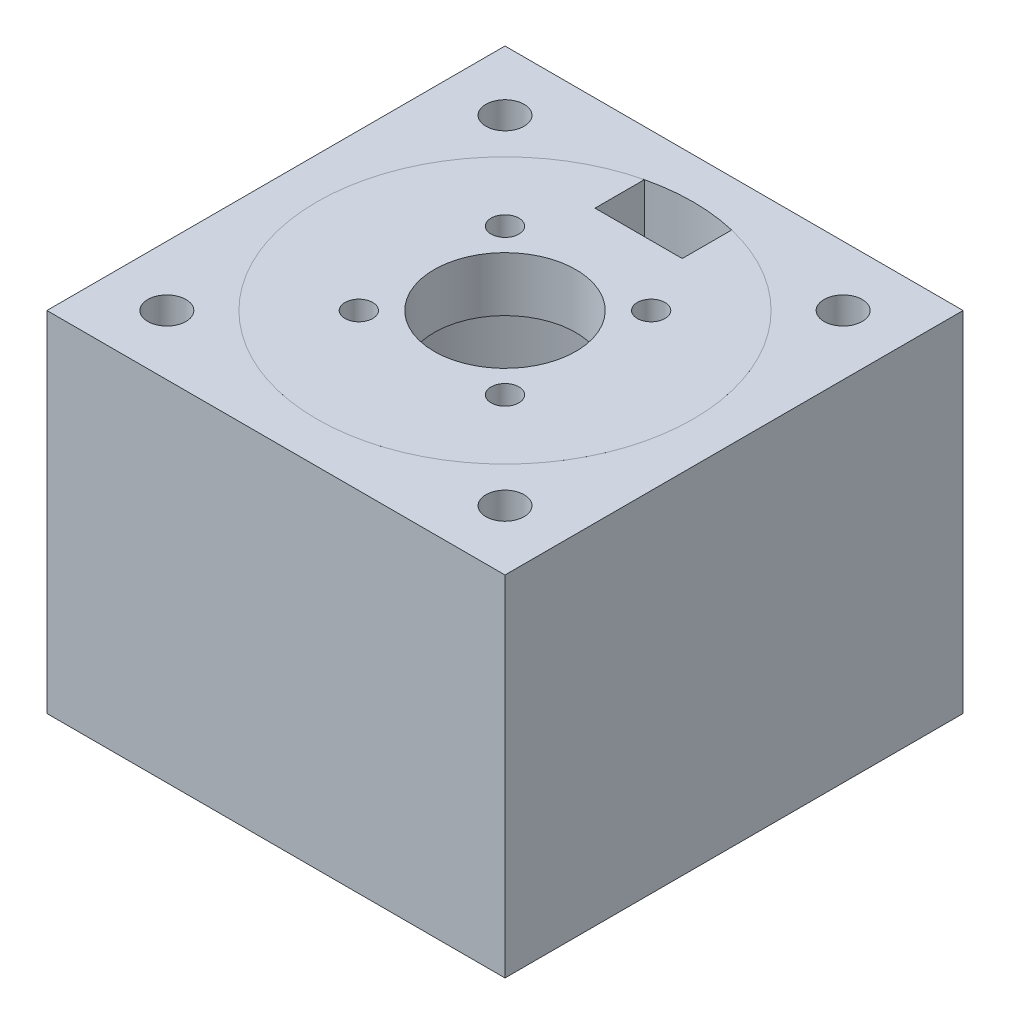
ISO-10303-21;
HEADER;
FILE_DESCRIPTION(('STEP AP214'),'2;1');
FILE_NAME('part.step','',(''),(''),'','','');
FILE_SCHEMA(('AUTOMOTIVE_DESIGN { 1 0 10303 214 1 1 1 1 }'));
ENDSEC;
DATA;
#1=APPLICATION_CONTEXT('core data for automotive mechanical design processes');
#2=APPLICATION_PROTOCOL_DEFINITION('international standard','automotive_design',2000,#1);
#3=PRODUCT_CONTEXT('',#1,'mechanical');
#4=PRODUCT('Part','Part','',(#3));
#5=PRODUCT_RELATED_PRODUCT_CATEGORY('part','',(#4));
#6=PRODUCT_DEFINITION_FORMATION('','',#4);
#7=PRODUCT_DEFINITION_CONTEXT('part definition',#1,'design');
#8=PRODUCT_DEFINITION('design','',#6,#7);
#9=PRODUCT_DEFINITION_SHAPE('','',#8);
#10=(LENGTH_UNIT() NAMED_UNIT(*) SI_UNIT(.MILLI.,.METRE.));
#11=(NAMED_UNIT(*) PLANE_ANGLE_UNIT() SI_UNIT($,.RADIAN.));
#12=(NAMED_UNIT(*) SI_UNIT($,.STERADIAN.) SOLID_ANGLE_UNIT());
#13=UNCERTAINTY_MEASURE_WITH_UNIT(LENGTH_MEASURE(1.E-05),#10,'distance_accuracy_value','');
#14=(GEOMETRIC_REPRESENTATION_CONTEXT(3) GLOBAL_UNCERTAINTY_ASSIGNED_CONTEXT((#13)) GLOBAL_UNIT_ASSIGNED_CONTEXT((#10,
#11,#12)) REPRESENTATION_CONTEXT('',''));
#15=CARTESIAN_POINT('',(0.,0.,0.));
#16=DIRECTION('',(0.,0.,1.));
#17=DIRECTION('',(1.,0.,0.));
#18=AXIS2_PLACEMENT_3D('',#15,#16,#17);
#19=CARTESIAN_POINT('',(21.,-27.,0.));
#20=DIRECTION('',(1.,0.,0.));
#21=DIRECTION('',(0.,0.,-1.));
#22=AXIS2_PLACEMENT_3D('',#19,#20,#21);
#23=PLANE('',#22);
#24=DIRECTION('',(0.,1.,0.));
#25=VECTOR('',#24,1.);
#26=CARTESIAN_POINT('',(21.,-27.,-21.));
#27=LINE('',#26,#25);
#28=CARTESIAN_POINT('',(21.,-27.,-21.));
#29=VERTEX_POINT('',#28);
#30=CARTESIAN_POINT('',(21.,5.,-21.));
#31=VERTEX_POINT('',#30);
#32=EDGE_CURVE('E108',#29,#31,#27,.T.);
#33=ORIENTED_EDGE('',*,*,#32,.T.);
#34=DIRECTION('',(0.,0.,-1.));
#35=VECTOR('',#34,1.);
#36=CARTESIAN_POINT('',(21.,5.,0.));
#37=LINE('',#36,#35);
#38=CARTESIAN_POINT('',(21.,5.,21.));
#39=VERTEX_POINT('',#38);
#40=EDGE_CURVE('E107',#39,#31,#37,.T.);
#41=ORIENTED_EDGE('',*,*,#40,.F.);
#42=DIRECTION('',(0.,1.,0.));
#43=VECTOR('',#42,1.);
#44=CARTESIAN_POINT('',(21.,-27.,21.));
#45=LINE('',#44,#43);
#46=CARTESIAN_POINT('',(21.,-27.,21.));
#47=VERTEX_POINT('',#46);
#48=EDGE_CURVE('E12',#47,#39,#45,.T.);
#49=ORIENTED_EDGE('',*,*,#48,.F.);
#50=DIRECTION('',(0.,0.,-1.));
#51=VECTOR('',#50,1.);
#52=CARTESIAN_POINT('',(21.,-27.,0.));
#53=LINE('',#52,#51);
#54=EDGE_CURVE('E162',#47,#29,#53,.T.);
#55=ORIENTED_EDGE('',*,*,#54,.T.);
#56=EDGE_LOOP('',(#33,#41,#49,#55));
#57=FACE_BOUND('',#56,.T.);
#58=ADVANCED_FACE('F59',(#57),#23,.T.);
#59=CARTESIAN_POINT('',(0.,-27.,21.));
#60=DIRECTION('',(0.,0.,1.));
#61=DIRECTION('',(1.,0.,0.));
#62=AXIS2_PLACEMENT_3D('',#59,#60,#61);
#63=PLANE('',#62);
#64=ORIENTED_EDGE('',*,*,#48,.T.);
#65=DIRECTION('',(1.,0.,0.));
#66=VECTOR('',#65,1.);
#67=CARTESIAN_POINT('',(0.,5.,21.));
#68=LINE('',#67,#66);
#69=CARTESIAN_POINT('',(-21.,5.,21.));
#70=VERTEX_POINT('',#69);
#71=EDGE_CURVE('E101',#70,#39,#68,.T.);
#72=ORIENTED_EDGE('',*,*,#71,.F.);
#73=DIRECTION('',(0.,1.,0.));
#74=VECTOR('',#73,1.);
#75=CARTESIAN_POINT('',(-21.,-27.,21.));
#76=LINE('',#75,#74);
#77=CARTESIAN_POINT('',(-21.,-27.,21.));
#78=VERTEX_POINT('',#77);
#79=EDGE_CURVE('E68',#78,#70,#76,.T.);
#80=ORIENTED_EDGE('',*,*,#79,.F.);
#81=DIRECTION('',(1.,0.,0.));
#82=VECTOR('',#81,1.);
#83=CARTESIAN_POINT('',(0.,-27.,21.));
#84=LINE('',#83,#82);
#85=EDGE_CURVE('E103',#78,#47,#84,.T.);
#86=ORIENTED_EDGE('',*,*,#85,.T.);
#87=EDGE_LOOP('',(#64,#72,#80,#86));
#88=FACE_BOUND('',#87,.T.);
#89=ADVANCED_FACE('F99',(#88),#63,.T.);
#90=CARTESIAN_POINT('',(-21.,-27.,0.));
#91=DIRECTION('',(1.,0.,0.));
#92=DIRECTION('',(0.,0.,-1.));
#93=AXIS2_PLACEMENT_3D('',#90,#91,#92);
#94=PLANE('',#93);
#95=ORIENTED_EDGE('',*,*,#79,.T.);
#96=DIRECTION('',(0.,0.,1.));
#97=VECTOR('',#96,1.);
#98=CARTESIAN_POINT('',(-21.,5.,0.));
#99=LINE('',#98,#97);
#100=CARTESIAN_POINT('',(-21.,5.,-21.));
#101=VERTEX_POINT('',#100);
#102=EDGE_CURVE('E119',#101,#70,#99,.T.);
#103=ORIENTED_EDGE('',*,*,#102,.F.);
#104=DIRECTION('',(0.,1.,0.));
#105=VECTOR('',#104,1.);
#106=CARTESIAN_POINT('',(-21.,-27.,-21.));
#107=LINE('',#106,#105);
#108=CARTESIAN_POINT('',(-21.,-27.,-21.));
#109=VERTEX_POINT('',#108);
#110=EDGE_CURVE('E185',#109,#101,#107,.T.);
#111=ORIENTED_EDGE('',*,*,#110,.F.);
#112=DIRECTION('',(0.,0.,-1.));
#113=VECTOR('',#112,1.);
#114=CARTESIAN_POINT('',(-21.,-27.,0.));
#115=LINE('',#114,#113);
#116=EDGE_CURVE('E167',#78,#109,#115,.T.);
#117=ORIENTED_EDGE('',*,*,#116,.F.);
#118=EDGE_LOOP('',(#95,#103,#111,#117));
#119=FACE_BOUND('',#118,.T.);
#120=ADVANCED_FACE('F190',(#119),#94,.F.);
#121=CARTESIAN_POINT('',(15.5,-27.,-15.5));
#122=DIRECTION('',(0.,1.,0.));
#123=DIRECTION('',(0.,0.,1.));
#124=AXIS2_PLACEMENT_3D('',#121,#122,#123);
#125=CYLINDRICAL_SURFACE('',#124,1.75);
#126=CARTESIAN_POINT('',(15.5,-27.,-15.5));
#127=DIRECTION('',(0.,-1.,0.));
#128=DIRECTION('',(0.,0.,-1.));
#129=AXIS2_PLACEMENT_3D('',#126,#127,#128);
#130=CIRCLE('',#129,1.75);
#131=CARTESIAN_POINT('',(15.5,-27.,-17.25));
#132=VERTEX_POINT('',#131);
#133=EDGE_CURVE('E172',#132,#132,#130,.T.);
#134=ORIENTED_EDGE('',*,*,#133,.T.);
#135=EDGE_LOOP('',(#134));
#136=FACE_BOUND('',#135,.T.);
#137=CARTESIAN_POINT('',(15.5,5.,-15.5));
#138=DIRECTION('',(0.,1.,0.));
#139=DIRECTION('',(0.,0.,1.));
#140=AXIS2_PLACEMENT_3D('',#137,#138,#139);
#141=CIRCLE('',#140,1.75);
#142=CARTESIAN_POINT('',(15.5,5.,-13.75));
#143=VERTEX_POINT('',#142);
#144=EDGE_CURVE('E137',#143,#143,#141,.F.);
#145=ORIENTED_EDGE('',*,*,#144,.F.);
#146=EDGE_LOOP('',(#145));
#147=FACE_BOUND('',#146,.T.);
#148=ADVANCED_FACE('F227',(#136,#147),#125,.F.);
#149=CARTESIAN_POINT('',(0.,-27.,-21.));
#150=DIRECTION('',(0.,0.,1.));
#151=DIRECTION('',(1.,0.,0.));
#152=AXIS2_PLACEMENT_3D('',#149,#150,#151);
#153=PLANE('',#152);
#154=ORIENTED_EDGE('',*,*,#110,.T.);
#155=DIRECTION('',(-1.,0.,0.));
#156=VECTOR('',#155,1.);
#157=CARTESIAN_POINT('',(0.,5.,-21.));
#158=LINE('',#157,#156);
#159=EDGE_CURVE('E113',#31,#101,#158,.T.);
#160=ORIENTED_EDGE('',*,*,#159,.F.);
#161=ORIENTED_EDGE('',*,*,#32,.F.);
#162=DIRECTION('',(1.,0.,0.));
#163=VECTOR('',#162,1.);
#164=CARTESIAN_POINT('',(0.,-27.,-21.));
#165=LINE('',#164,#163);
#166=EDGE_CURVE('E75',#109,#29,#165,.T.);
#167=ORIENTED_EDGE('',*,*,#166,.F.);
#168=EDGE_LOOP('',(#154,#160,#161,#167));
#169=FACE_BOUND('',#168,.T.);
#170=ADVANCED_FACE('F219',(#169),#153,.F.);
#171=CARTESIAN_POINT('',(-15.5,-27.,15.5));
#172=DIRECTION('',(0.,1.,0.));
#173=DIRECTION('',(0.,0.,1.));
#174=AXIS2_PLACEMENT_3D('',#171,#172,#173);
#175=CYLINDRICAL_SURFACE('',#174,1.75);
#176=CARTESIAN_POINT('',(-15.5,-27.,15.5));
#177=DIRECTION('',(0.,-1.,0.));
#178=DIRECTION('',(0.,0.,-1.));
#179=AXIS2_PLACEMENT_3D('',#176,#177,#178);
#180=CIRCLE('',#179,1.75);
#181=CARTESIAN_POINT('',(-15.5,-27.,13.75));
#182=VERTEX_POINT('',#181);
#183=EDGE_CURVE('E158',#182,#182,#180,.T.);
#184=ORIENTED_EDGE('',*,*,#183,.T.);
#185=EDGE_LOOP('',(#184));
#186=FACE_BOUND('',#185,.T.);
#187=CARTESIAN_POINT('',(-15.5,5.,15.5));
#188=DIRECTION('',(0.,1.,0.));
#189=DIRECTION('',(0.,0.,1.));
#190=AXIS2_PLACEMENT_3D('',#187,#188,#189);
#191=CIRCLE('',#190,1.75);
#192=CARTESIAN_POINT('',(-15.5,5.,17.25));
#193=VERTEX_POINT('',#192);
#194=EDGE_CURVE('E141',#193,#193,#191,.F.);
#195=ORIENTED_EDGE('',*,*,#194,.F.);
#196=EDGE_LOOP('',(#195));
#197=FACE_BOUND('',#196,.T.);
#198=ADVANCED_FACE('F216',(#186,#197),#175,.F.);
#199=CARTESIAN_POINT('',(15.5,-27.,15.5));
#200=DIRECTION('',(0.,1.,0.));
#201=DIRECTION('',(0.,0.,1.));
#202=AXIS2_PLACEMENT_3D('',#199,#200,#201);
#203=CYLINDRICAL_SURFACE('',#202,1.75);
#204=CARTESIAN_POINT('',(15.5,-27.,15.5));
#205=DIRECTION('',(0.,-1.,0.));
#206=DIRECTION('',(0.,0.,-1.));
#207=AXIS2_PLACEMENT_3D('',#204,#205,#206);
#208=CIRCLE('',#207,1.75);
#209=CARTESIAN_POINT('',(15.5,-27.,13.75));
#210=VERTEX_POINT('',#209);
#211=EDGE_CURVE('E154',#210,#210,#208,.F.);
#212=ORIENTED_EDGE('',*,*,#211,.F.);
#213=EDGE_LOOP('',(#212));
#214=FACE_BOUND('',#213,.T.);
#215=CARTESIAN_POINT('',(15.5,5.,15.5));
#216=DIRECTION('',(0.,1.,0.));
#217=DIRECTION('',(0.,0.,1.));
#218=AXIS2_PLACEMENT_3D('',#215,#216,#217);
#219=CIRCLE('',#218,1.75);
#220=CARTESIAN_POINT('',(15.5,5.,17.25));
#221=VERTEX_POINT('',#220);
#222=EDGE_CURVE('E121',#221,#221,#219,.F.);
#223=ORIENTED_EDGE('',*,*,#222,.F.);
#224=EDGE_LOOP('',(#223));
#225=FACE_BOUND('',#224,.T.);
#226=ADVANCED_FACE('F218',(#214,#225),#203,.F.);
#227=CARTESIAN_POINT('',(0.,-27.,0.));
#228=DIRECTION('',(0.,1.,0.));
#229=DIRECTION('',(0.,0.,1.));
#230=AXIS2_PLACEMENT_3D('',#227,#228,#229);
#231=CYLINDRICAL_SURFACE('',#230,17.5);
#232=CARTESIAN_POINT('',(0.,-27.,0.));
#233=DIRECTION('',(0.,-1.,0.));
#234=DIRECTION('',(0.,0.,-1.));
#235=AXIS2_PLACEMENT_3D('',#232,#233,#234);
#236=CIRCLE('',#235,17.5);
#237=CARTESIAN_POINT('',(0.,-27.,-17.5));
#238=VERTEX_POINT('',#237);
#239=EDGE_CURVE('E150',#238,#238,#236,.T.);
#240=ORIENTED_EDGE('',*,*,#239,.T.);
#241=EDGE_LOOP('',(#240));
#242=FACE_BOUND('',#241,.T.);
#243=CARTESIAN_POINT('',(0.,0.,0.));
#244=DIRECTION('',(0.,-1.,0.));
#245=DIRECTION('',(0.,0.,-1.));
#246=AXIS2_PLACEMENT_3D('',#243,#244,#245);
#247=CIRCLE('',#246,17.5);
#248=CARTESIAN_POINT('',(0.,0.,-17.5));
#249=VERTEX_POINT('',#248);
#250=EDGE_CURVE('E145',#249,#249,#247,.T.);
#251=ORIENTED_EDGE('',*,*,#250,.F.);
#252=EDGE_LOOP('',(#251));
#253=FACE_BOUND('',#252,.T.);
#254=ADVANCED_FACE('F61',(#242,#253),#231,.F.);
#255=CARTESIAN_POINT('',(-15.5,-27.,-15.5));
#256=DIRECTION('',(0.,1.,0.));
#257=DIRECTION('',(0.,0.,1.));
#258=AXIS2_PLACEMENT_3D('',#255,#256,#257);
#259=CYLINDRICAL_SURFACE('',#258,1.75);
#260=CARTESIAN_POINT('',(-15.5,-27.,-15.5));
#261=DIRECTION('',(0.,-1.,0.));
#262=DIRECTION('',(0.,0.,-1.));
#263=AXIS2_PLACEMENT_3D('',#260,#261,#262);
#264=CIRCLE('',#263,1.75);
#265=CARTESIAN_POINT('',(-15.5,-27.,-17.25));
#266=VERTEX_POINT('',#265);
#267=EDGE_CURVE('E176',#266,#266,#264,.F.);
#268=ORIENTED_EDGE('',*,*,#267,.F.);
#269=EDGE_LOOP('',(#268));
#270=FACE_BOUND('',#269,.T.);
#271=CARTESIAN_POINT('',(-15.5,5.,-15.5));
#272=DIRECTION('',(0.,1.,0.));
#273=DIRECTION('',(0.,0.,1.));
#274=AXIS2_PLACEMENT_3D('',#271,#272,#273);
#275=CIRCLE('',#274,1.75);
#276=CARTESIAN_POINT('',(-15.5,5.,-13.75));
#277=VERTEX_POINT('',#276);
#278=EDGE_CURVE('E133',#277,#277,#275,.F.);
#279=ORIENTED_EDGE('',*,*,#278,.F.);
#280=EDGE_LOOP('',(#279));
#281=FACE_BOUND('',#280,.T.);
#282=ADVANCED_FACE('F196',(#270,#281),#259,.F.);
#283=CARTESIAN_POINT('',(0.,-27.,0.));
#284=DIRECTION('',(0.,-1.,0.));
#285=DIRECTION('',(0.,0.,-1.));
#286=AXIS2_PLACEMENT_3D('',#283,#284,#285);
#287=PLANE('',#286);
#288=ORIENTED_EDGE('',*,*,#239,.F.);
#289=EDGE_LOOP('',(#288));
#290=FACE_BOUND('',#289,.T.);
#291=ORIENTED_EDGE('',*,*,#211,.T.);
#292=EDGE_LOOP('',(#291));
#293=FACE_BOUND('',#292,.T.);
#294=ORIENTED_EDGE('',*,*,#183,.F.);
#295=EDGE_LOOP('',(#294));
#296=FACE_BOUND('',#295,.T.);
#297=ORIENTED_EDGE('',*,*,#54,.F.);
#298=ORIENTED_EDGE('',*,*,#85,.F.);
#299=ORIENTED_EDGE('',*,*,#116,.T.);
#300=ORIENTED_EDGE('',*,*,#166,.T.);
#301=EDGE_LOOP('',(#297,#298,#299,#300));
#302=FACE_BOUND('',#301,.T.);
#303=ORIENTED_EDGE('',*,*,#133,.F.);
#304=EDGE_LOOP('',(#303));
#305=FACE_BOUND('',#304,.T.);
#306=ORIENTED_EDGE('',*,*,#267,.T.);
#307=EDGE_LOOP('',(#306));
#308=FACE_BOUND('',#307,.T.);
#309=ADVANCED_FACE('F192',(#290,#293,#296,#302,#305,#308),#287,.T.);
#310=CARTESIAN_POINT('',(0.,0.,0.));
#311=DIRECTION('',(0.,1.,0.));
#312=DIRECTION('',(0.,0.,1.));
#313=AXIS2_PLACEMENT_3D('',#310,#311,#312);
#314=PLANE('',#313);
#315=CARTESIAN_POINT('',(0.,0.,0.));
#316=DIRECTION('',(0.,1.,0.));
#317=DIRECTION('',(0.,0.,1.));
#318=AXIS2_PLACEMENT_3D('',#315,#316,#317);
#319=CIRCLE('',#318,17.25);
#320=CARTESIAN_POINT('',(0.,0.,17.25));
#321=VERTEX_POINT('',#320);
#322=EDGE_CURVE('E146',#321,#321,#319,.T.);
#323=ORIENTED_EDGE('',*,*,#322,.T.);
#324=EDGE_LOOP('',(#323));
#325=FACE_BOUND('',#324,.T.);
#326=ORIENTED_EDGE('',*,*,#250,.T.);
#327=EDGE_LOOP('',(#326));
#328=FACE_BOUND('',#327,.T.);
#329=ADVANCED_FACE('F195',(#325,#328),#314,.F.);
#330=CARTESIAN_POINT('',(0.,5.,0.));
#331=DIRECTION('',(0.,-1.,0.));
#332=DIRECTION('',(0.,0.,-1.));
#333=AXIS2_PLACEMENT_3D('',#330,#331,#332);
#334=CYLINDRICAL_SURFACE('',#333,17.25);
#335=CARTESIAN_POINT('',(0.,5.,0.));
#336=DIRECTION('',(0.,1.,0.));
#337=DIRECTION('',(0.,0.,1.));
#338=AXIS2_PLACEMENT_3D('',#335,#336,#337);
#339=CIRCLE('',#338,17.25);
#340=CARTESIAN_POINT('',(0.,5.,17.25));
#341=VERTEX_POINT('',#340);
#342=EDGE_CURVE('E125',#341,#341,#339,.T.);
#343=ORIENTED_EDGE('',*,*,#342,.T.);
#344=EDGE_LOOP('',(#343));
#345=FACE_BOUND('',#344,.T.);
#346=ORIENTED_EDGE('',*,*,#322,.F.);
#347=EDGE_LOOP('',(#346));
#348=FACE_BOUND('',#347,.T.);
#349=ADVANCED_FACE('F209',(#345,#348),#334,.F.);
#350=CARTESIAN_POINT('',(0.,5.,0.));
#351=DIRECTION('',(0.,1.,0.));
#352=DIRECTION('',(0.,0.,1.));
#353=AXIS2_PLACEMENT_3D('',#350,#351,#352);
#354=PLANE('',#353);
#355=ORIENTED_EDGE('',*,*,#342,.F.);
#356=EDGE_LOOP('',(#355));
#357=FACE_BOUND('',#356,.T.);
#358=ORIENTED_EDGE('',*,*,#222,.T.);
#359=EDGE_LOOP('',(#358));
#360=FACE_BOUND('',#359,.T.);
#361=ORIENTED_EDGE('',*,*,#71,.T.);
#362=ORIENTED_EDGE('',*,*,#40,.T.);
#363=ORIENTED_EDGE('',*,*,#159,.T.);
#364=ORIENTED_EDGE('',*,*,#102,.T.);
#365=EDGE_LOOP('',(#361,#362,#363,#364));
#366=FACE_BOUND('',#365,.T.);
#367=ORIENTED_EDGE('',*,*,#278,.T.);
#368=EDGE_LOOP('',(#367));
#369=FACE_BOUND('',#368,.T.);
#370=ORIENTED_EDGE('',*,*,#144,.T.);
#371=EDGE_LOOP('',(#370));
#372=FACE_BOUND('',#371,.T.);
#373=ORIENTED_EDGE('',*,*,#194,.T.);
#374=EDGE_LOOP('',(#373));
#375=FACE_BOUND('',#374,.T.);
#376=ADVANCED_FACE('F116',(#357,#360,#366,#369,#372,#375),#354,.T.);
#377=CLOSED_SHELL('',(#58,#89,#120,#148,#170,#198,#226,#254,#282,#309,#329,#349,#376));
#378=MANIFOLD_SOLID_BREP('B2',#377);
#379=CARTESIAN_POINT('',(-4.,5.,0.));
#380=DIRECTION('',(1.,0.,0.));
#381=DIRECTION('',(0.,0.,-1.));
#382=AXIS2_PLACEMENT_3D('',#379,#380,#381);
#383=PLANE('',#382);
#384=DIRECTION('',(0.,0.,1.));
#385=VECTOR('',#384,1.);
#386=CARTESIAN_POINT('',(-4.,0.,0.));
#387=LINE('',#386,#385);
#388=CARTESIAN_POINT('',(-4.,0.,-16.7798241945498));
#389=VERTEX_POINT('',#388);
#390=CARTESIAN_POINT('',(-4.,0.,-12.25));
#391=VERTEX_POINT('',#390);
#392=EDGE_CURVE('E474',#389,#391,#387,.T.);
#393=ORIENTED_EDGE('',*,*,#392,.F.);
#394=DIRECTION('',(0.,-1.,0.));
#395=VECTOR('',#394,1.);
#396=CARTESIAN_POINT('',(-4.,5.,-16.7798241945498));
#397=LINE('',#396,#395);
#398=CARTESIAN_POINT('',(-4.,5.,-16.7798241945498));
#399=VERTEX_POINT('',#398);
#400=EDGE_CURVE('E57',#399,#389,#397,.T.);
#401=ORIENTED_EDGE('',*,*,#400,.F.);
#402=DIRECTION('',(0.,0.,1.));
#403=VECTOR('',#402,1.);
#404=CARTESIAN_POINT('',(-4.,5.,0.));
#405=LINE('',#404,#403);
#406=CARTESIAN_POINT('',(-4.,5.,-12.25));
#407=VERTEX_POINT('',#406);
#408=EDGE_CURVE('E451',#399,#407,#405,.T.);
#409=ORIENTED_EDGE('',*,*,#408,.T.);
#410=DIRECTION('',(0.,-1.,0.));
#411=VECTOR('',#410,1.);
#412=CARTESIAN_POINT('',(-4.,5.,-12.25));
#413=LINE('',#412,#411);
#414=EDGE_CURVE('E412',#407,#391,#413,.T.);
#415=ORIENTED_EDGE('',*,*,#414,.T.);
#416=EDGE_LOOP('',(#393,#401,#409,#415));
#417=FACE_BOUND('',#416,.T.);
#418=ADVANCED_FACE('F395',(#417),#383,.T.);
#419=CARTESIAN_POINT('',(0.,5.,0.));
#420=DIRECTION('',(0.,-1.,0.));
#421=DIRECTION('',(0.,0.,-1.));
#422=AXIS2_PLACEMENT_3D('',#419,#420,#421);
#423=CYLINDRICAL_SURFACE('',#422,17.25);
#424=CARTESIAN_POINT('',(0.,0.,0.));
#425=DIRECTION('',(0.,1.,0.));
#426=DIRECTION('',(0.,0.,1.));
#427=AXIS2_PLACEMENT_3D('',#424,#425,#426);
#428=CIRCLE('',#427,17.25);
#429=CARTESIAN_POINT('',(4.,0.,-16.7798241945498));
#430=VERTEX_POINT('',#429);
#431=EDGE_CURVE('E456',#389,#430,#428,.T.);
#432=ORIENTED_EDGE('',*,*,#431,.T.);
#433=DIRECTION('',(0.,-1.,0.));
#434=VECTOR('',#433,1.);
#435=CARTESIAN_POINT('',(4.,5.,-16.7798241945498));
#436=LINE('',#435,#434);
#437=CARTESIAN_POINT('',(4.,5.,-16.7798241945498));
#438=VERTEX_POINT('',#437);
#439=EDGE_CURVE('E404',#438,#430,#436,.T.);
#440=ORIENTED_EDGE('',*,*,#439,.F.);
#441=CARTESIAN_POINT('',(0.,5.,0.));
#442=DIRECTION('',(0.,1.,0.));
#443=DIRECTION('',(0.,0.,1.));
#444=AXIS2_PLACEMENT_3D('',#441,#442,#443);
#445=CIRCLE('',#444,17.25);
#446=EDGE_CURVE('E446',#399,#438,#445,.T.);
#447=ORIENTED_EDGE('',*,*,#446,.F.);
#448=ORIENTED_EDGE('',*,*,#400,.T.);
#449=EDGE_LOOP('',(#432,#440,#447,#448));
#450=FACE_BOUND('',#449,.T.);
#451=ADVANCED_FACE('F454',(#450),#423,.T.);
#452=CARTESIAN_POINT('',(4.,5.,0.));
#453=DIRECTION('',(1.,0.,0.));
#454=DIRECTION('',(0.,0.,-1.));
#455=AXIS2_PLACEMENT_3D('',#452,#453,#454);
#456=PLANE('',#455);
#457=DIRECTION('',(0.,0.,1.));
#458=VECTOR('',#457,1.);
#459=CARTESIAN_POINT('',(4.,0.,0.));
#460=LINE('',#459,#458);
#461=CARTESIAN_POINT('',(4.,0.,-12.25));
#462=VERTEX_POINT('',#461);
#463=EDGE_CURVE('E471',#430,#462,#460,.T.);
#464=ORIENTED_EDGE('',*,*,#463,.T.);
#465=DIRECTION('',(0.,-1.,0.));
#466=VECTOR('',#465,1.);
#467=CARTESIAN_POINT('',(4.,5.,-12.25));
#468=LINE('',#467,#466);
#469=CARTESIAN_POINT('',(4.,5.,-12.25));
#470=VERTEX_POINT('',#469);
#471=EDGE_CURVE('E426',#470,#462,#468,.T.);
#472=ORIENTED_EDGE('',*,*,#471,.F.);
#473=DIRECTION('',(0.,0.,1.));
#474=VECTOR('',#473,1.);
#475=CARTESIAN_POINT('',(4.,5.,0.));
#476=LINE('',#475,#474);
#477=EDGE_CURVE('E438',#438,#470,#476,.T.);
#478=ORIENTED_EDGE('',*,*,#477,.F.);
#479=ORIENTED_EDGE('',*,*,#439,.T.);
#480=EDGE_LOOP('',(#464,#472,#478,#479));
#481=FACE_BOUND('',#480,.T.);
#482=ADVANCED_FACE('F440',(#481),#456,.F.);
#483=CARTESIAN_POINT('',(6.7,5.,6.7));
#484=DIRECTION('',(0.,-1.,0.));
#485=DIRECTION('',(0.,0.,-1.));
#486=AXIS2_PLACEMENT_3D('',#483,#484,#485);
#487=CYLINDRICAL_SURFACE('',#486,1.275);
#488=CARTESIAN_POINT('',(6.7,5.,6.7));
#489=DIRECTION('',(0.,1.,0.));
#490=DIRECTION('',(0.,0.,1.));
#491=AXIS2_PLACEMENT_3D('',#488,#489,#490);
#492=CIRCLE('',#491,1.275);
#493=CARTESIAN_POINT('',(6.7,5.,7.975));
#494=VERTEX_POINT('',#493);
#495=EDGE_CURVE('E487',#494,#494,#492,.T.);
#496=ORIENTED_EDGE('',*,*,#495,.T.);
#497=EDGE_LOOP('',(#496));
#498=FACE_BOUND('',#497,.T.);
#499=CARTESIAN_POINT('',(6.7,0.,6.7));
#500=DIRECTION('',(0.,1.,0.));
#501=DIRECTION('',(0.,0.,1.));
#502=AXIS2_PLACEMENT_3D('',#499,#500,#501);
#503=CIRCLE('',#502,1.275);
#504=CARTESIAN_POINT('',(6.7,0.,7.975));
#505=VERTEX_POINT('',#504);
#506=EDGE_CURVE('E465',#505,#505,#503,.T.);
#507=ORIENTED_EDGE('',*,*,#506,.F.);
#508=EDGE_LOOP('',(#507));
#509=FACE_BOUND('',#508,.T.);
#510=ADVANCED_FACE('F588',(#498,#509),#487,.F.);
#511=CARTESIAN_POINT('',(0.,5.,-12.25));
#512=DIRECTION('',(0.,0.,-1.));
#513=DIRECTION('',(-1.,0.,0.));
#514=AXIS2_PLACEMENT_3D('',#511,#512,#513);
#515=PLANE('',#514);
#516=DIRECTION('',(1.,0.,0.));
#517=VECTOR('',#516,1.);
#518=CARTESIAN_POINT('',(0.,0.,-12.25));
#519=LINE('',#518,#517);
#520=EDGE_CURVE('E468',#391,#462,#519,.T.);
#521=ORIENTED_EDGE('',*,*,#520,.F.);
#522=ORIENTED_EDGE('',*,*,#414,.F.);
#523=DIRECTION('',(1.,0.,0.));
#524=VECTOR('',#523,1.);
#525=CARTESIAN_POINT('',(0.,5.,-12.25));
#526=LINE('',#525,#524);
#527=EDGE_CURVE('E445',#407,#470,#526,.T.);
#528=ORIENTED_EDGE('',*,*,#527,.T.);
#529=ORIENTED_EDGE('',*,*,#471,.T.);
#530=EDGE_LOOP('',(#521,#522,#528,#529));
#531=FACE_BOUND('',#530,.T.);
#532=ADVANCED_FACE('F516',(#531),#515,.T.);
#533=CARTESIAN_POINT('',(-6.7,5.,-6.7));
#534=DIRECTION('',(0.,-1.,0.));
#535=DIRECTION('',(0.,0.,-1.));
#536=AXIS2_PLACEMENT_3D('',#533,#534,#535);
#537=CYLINDRICAL_SURFACE('',#536,1.275);
#538=CARTESIAN_POINT('',(-6.7,5.,-6.7));
#539=DIRECTION('',(0.,1.,0.));
#540=DIRECTION('',(0.,0.,1.));
#541=AXIS2_PLACEMENT_3D('',#538,#539,#540);
#542=CIRCLE('',#541,1.275);
#543=CARTESIAN_POINT('',(-6.7,5.,-5.425));
#544=VERTEX_POINT('',#543);
#545=EDGE_CURVE('E492',#544,#544,#542,.T.);
#546=ORIENTED_EDGE('',*,*,#545,.T.);
#547=EDGE_LOOP('',(#546));
#548=FACE_BOUND('',#547,.T.);
#549=CARTESIAN_POINT('',(-6.7,0.,-6.7));
#550=DIRECTION('',(0.,1.,0.));
#551=DIRECTION('',(0.,0.,1.));
#552=AXIS2_PLACEMENT_3D('',#549,#550,#551);
#553=CIRCLE('',#552,1.275);
#554=CARTESIAN_POINT('',(-6.7,0.,-5.425));
#555=VERTEX_POINT('',#554);
#556=EDGE_CURVE('E476',#555,#555,#553,.T.);
#557=ORIENTED_EDGE('',*,*,#556,.F.);
#558=EDGE_LOOP('',(#557));
#559=FACE_BOUND('',#558,.T.);
#560=ADVANCED_FACE('F512',(#548,#559),#537,.F.);
#561=CARTESIAN_POINT('',(6.7,5.,-6.7));
#562=DIRECTION('',(0.,-1.,0.));
#563=DIRECTION('',(0.,0.,-1.));
#564=AXIS2_PLACEMENT_3D('',#561,#562,#563);
#565=CYLINDRICAL_SURFACE('',#564,1.275);
#566=CARTESIAN_POINT('',(6.7,5.,-6.7));
#567=DIRECTION('',(0.,1.,0.));
#568=DIRECTION('',(0.,0.,1.));
#569=AXIS2_PLACEMENT_3D('',#566,#567,#568);
#570=CIRCLE('',#569,1.275);
#571=CARTESIAN_POINT('',(6.7,5.,-5.425));
#572=VERTEX_POINT('',#571);
#573=EDGE_CURVE('E495',#572,#572,#570,.F.);
#574=ORIENTED_EDGE('',*,*,#573,.F.);
#575=EDGE_LOOP('',(#574));
#576=FACE_BOUND('',#575,.T.);
#577=CARTESIAN_POINT('',(6.7,0.,-6.7));
#578=DIRECTION('',(0.,1.,0.));
#579=DIRECTION('',(0.,0.,1.));
#580=AXIS2_PLACEMENT_3D('',#577,#578,#579);
#581=CIRCLE('',#580,1.275);
#582=CARTESIAN_POINT('',(6.7,0.,-5.425));
#583=VERTEX_POINT('',#582);
#584=EDGE_CURVE('E479',#583,#583,#581,.F.);
#585=ORIENTED_EDGE('',*,*,#584,.T.);
#586=EDGE_LOOP('',(#585));
#587=FACE_BOUND('',#586,.T.);
#588=ADVANCED_FACE('F515',(#576,#587),#565,.F.);
#589=CARTESIAN_POINT('',(0.,5.,0.));
#590=DIRECTION('',(0.,-1.,0.));
#591=DIRECTION('',(0.,0.,-1.));
#592=AXIS2_PLACEMENT_3D('',#589,#590,#591);
#593=CYLINDRICAL_SURFACE('',#592,6.5);
#594=CARTESIAN_POINT('',(0.,5.,0.));
#595=DIRECTION('',(0.,1.,0.));
#596=DIRECTION('',(0.,0.,1.));
#597=AXIS2_PLACEMENT_3D('',#594,#595,#596);
#598=CIRCLE('',#597,6.5);
#599=CARTESIAN_POINT('',(0.,5.,6.5));
#600=VERTEX_POINT('',#599);
#601=EDGE_CURVE('E464',#600,#600,#598,.T.);
#602=ORIENTED_EDGE('',*,*,#601,.T.);
#603=EDGE_LOOP('',(#602));
#604=FACE_BOUND('',#603,.T.);
#605=CARTESIAN_POINT('',(0.,0.,0.));
#606=DIRECTION('',(0.,1.,0.));
#607=DIRECTION('',(0.,0.,1.));
#608=AXIS2_PLACEMENT_3D('',#605,#606,#607);
#609=CIRCLE('',#608,6.5);
#610=CARTESIAN_POINT('',(0.,0.,6.5));
#611=VERTEX_POINT('',#610);
#612=EDGE_CURVE('E482',#611,#611,#609,.T.);
#613=ORIENTED_EDGE('',*,*,#612,.F.);
#614=EDGE_LOOP('',(#613));
#615=FACE_BOUND('',#614,.T.);
#616=ADVANCED_FACE('F397',(#604,#615),#593,.F.);
#617=CARTESIAN_POINT('',(-6.7,5.,6.7));
#618=DIRECTION('',(0.,-1.,0.));
#619=DIRECTION('',(0.,0.,-1.));
#620=AXIS2_PLACEMENT_3D('',#617,#618,#619);
#621=CYLINDRICAL_SURFACE('',#620,1.275);
#622=CARTESIAN_POINT('',(-6.7,5.,6.7));
#623=DIRECTION('',(0.,1.,0.));
#624=DIRECTION('',(0.,0.,1.));
#625=AXIS2_PLACEMENT_3D('',#622,#623,#624);
#626=CIRCLE('',#625,1.275);
#627=CARTESIAN_POINT('',(-6.7,5.,7.975));
#628=VERTEX_POINT('',#627);
#629=EDGE_CURVE('E460',#628,#628,#626,.F.);
#630=ORIENTED_EDGE('',*,*,#629,.F.);
#631=EDGE_LOOP('',(#630));
#632=FACE_BOUND('',#631,.T.);
#633=CARTESIAN_POINT('',(-6.7,0.,6.7));
#634=DIRECTION('',(0.,1.,0.));
#635=DIRECTION('',(0.,0.,1.));
#636=AXIS2_PLACEMENT_3D('',#633,#634,#635);
#637=CIRCLE('',#636,1.275);
#638=CARTESIAN_POINT('',(-6.7,0.,7.975));
#639=VERTEX_POINT('',#638);
#640=EDGE_CURVE('E461',#639,#639,#637,.F.);
#641=ORIENTED_EDGE('',*,*,#640,.T.);
#642=EDGE_LOOP('',(#641));
#643=FACE_BOUND('',#642,.T.);
#644=ADVANCED_FACE('F506',(#632,#643),#621,.F.);
#645=CARTESIAN_POINT('',(0.,5.,0.));
#646=DIRECTION('',(0.,1.,0.));
#647=DIRECTION('',(0.,0.,1.));
#648=AXIS2_PLACEMENT_3D('',#645,#646,#647);
#649=PLANE('',#648);
#650=ORIENTED_EDGE('',*,*,#601,.F.);
#651=EDGE_LOOP('',(#650));
#652=FACE_BOUND('',#651,.T.);
#653=ORIENTED_EDGE('',*,*,#573,.T.);
#654=EDGE_LOOP('',(#653));
#655=FACE_BOUND('',#654,.T.);
#656=ORIENTED_EDGE('',*,*,#545,.F.);
#657=EDGE_LOOP('',(#656));
#658=FACE_BOUND('',#657,.T.);
#659=ORIENTED_EDGE('',*,*,#408,.F.);
#660=ORIENTED_EDGE('',*,*,#446,.T.);
#661=ORIENTED_EDGE('',*,*,#477,.T.);
#662=ORIENTED_EDGE('',*,*,#527,.F.);
#663=EDGE_LOOP('',(#659,#660,#661,#662));
#664=FACE_BOUND('',#663,.T.);
#665=ORIENTED_EDGE('',*,*,#495,.F.);
#666=EDGE_LOOP('',(#665));
#667=FACE_BOUND('',#666,.T.);
#668=ORIENTED_EDGE('',*,*,#629,.T.);
#669=EDGE_LOOP('',(#668));
#670=FACE_BOUND('',#669,.T.);
#671=ADVANCED_FACE('F449',(#652,#655,#658,#664,#667,#670),#649,.T.);
#672=CARTESIAN_POINT('',(0.,0.,0.));
#673=DIRECTION('',(0.,1.,0.));
#674=DIRECTION('',(0.,0.,1.));
#675=AXIS2_PLACEMENT_3D('',#672,#673,#674);
#676=PLANE('',#675);
#677=ORIENTED_EDGE('',*,*,#612,.T.);
#678=EDGE_LOOP('',(#677));
#679=FACE_BOUND('',#678,.T.);
#680=ORIENTED_EDGE('',*,*,#584,.F.);
#681=EDGE_LOOP('',(#680));
#682=FACE_BOUND('',#681,.T.);
#683=ORIENTED_EDGE('',*,*,#556,.T.);
#684=EDGE_LOOP('',(#683));
#685=FACE_BOUND('',#684,.T.);
#686=ORIENTED_EDGE('',*,*,#392,.T.);
#687=ORIENTED_EDGE('',*,*,#520,.T.);
#688=ORIENTED_EDGE('',*,*,#463,.F.);
#689=ORIENTED_EDGE('',*,*,#431,.F.);
#690=EDGE_LOOP('',(#686,#687,#688,#689));
#691=FACE_BOUND('',#690,.T.);
#692=ORIENTED_EDGE('',*,*,#506,.T.);
#693=EDGE_LOOP('',(#692));
#694=FACE_BOUND('',#693,.T.);
#695=ORIENTED_EDGE('',*,*,#640,.F.);
#696=EDGE_LOOP('',(#695));
#697=FACE_BOUND('',#696,.T.);
#698=ADVANCED_FACE('F505',(#679,#682,#685,#691,#694,#697),#676,.F.);
#699=CLOSED_SHELL('',(#418,#451,#482,#510,#532,#560,#588,#616,#644,#671,#698));
#700=MANIFOLD_SOLID_BREP('B6',#699);
#701=ADVANCED_BREP_SHAPE_REPRESENTATION('',(#18,#378,#700),#14);
#702=SHAPE_DEFINITION_REPRESENTATION(#9,#701);
ENDSEC;
END-ISO-10303-21;
